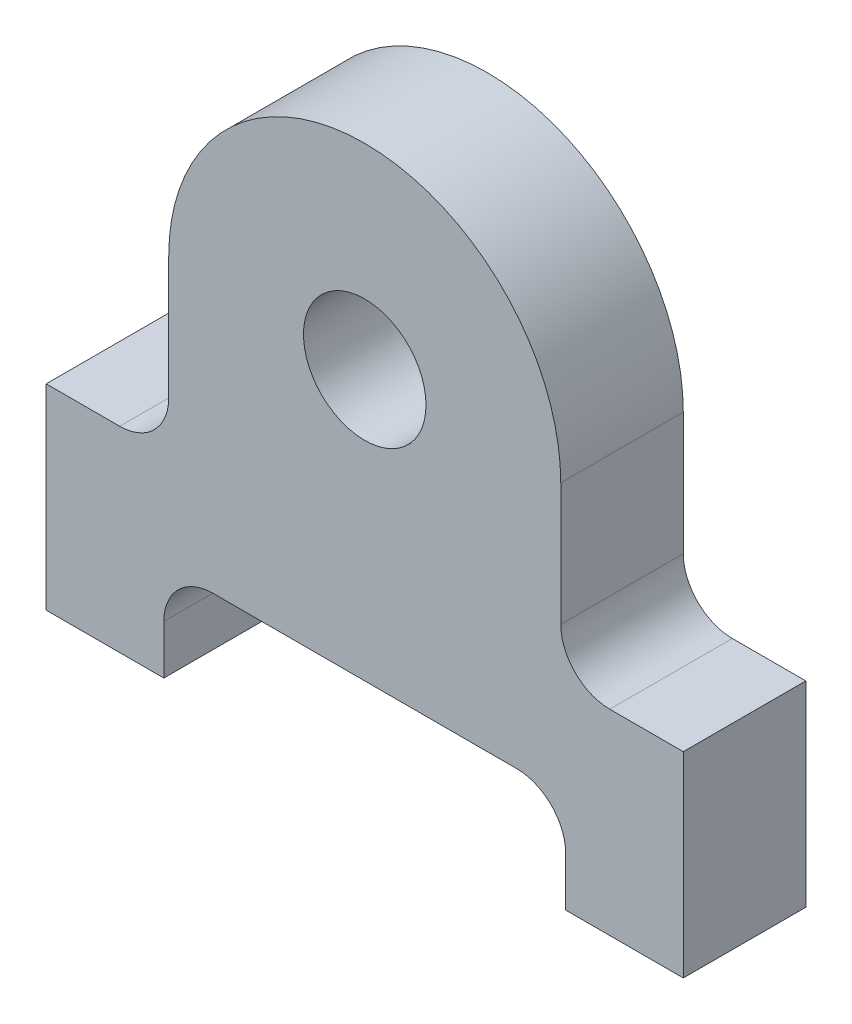
ISO-10303-21;
HEADER;
FILE_DESCRIPTION(('STEP AP214'),'2;1');
FILE_NAME('part.step','',(''),(''),'','','');
FILE_SCHEMA(('AUTOMOTIVE_DESIGN { 1 0 10303 214 1 1 1 1 }'));
ENDSEC;
DATA;
#1=APPLICATION_CONTEXT('core data for automotive mechanical design processes');
#2=APPLICATION_PROTOCOL_DEFINITION('international standard','automotive_design',2000,#1);
#3=PRODUCT_CONTEXT('',#1,'mechanical');
#4=PRODUCT('Part','Part','',(#3));
#5=PRODUCT_RELATED_PRODUCT_CATEGORY('part','',(#4));
#6=PRODUCT_DEFINITION_FORMATION('','',#4);
#7=PRODUCT_DEFINITION_CONTEXT('part definition',#1,'design');
#8=PRODUCT_DEFINITION('design','',#6,#7);
#9=PRODUCT_DEFINITION_SHAPE('','',#8);
#10=(LENGTH_UNIT() NAMED_UNIT(*) SI_UNIT(.MILLI.,.METRE.));
#11=(NAMED_UNIT(*) PLANE_ANGLE_UNIT() SI_UNIT($,.RADIAN.));
#12=(NAMED_UNIT(*) SI_UNIT($,.STERADIAN.) SOLID_ANGLE_UNIT());
#13=UNCERTAINTY_MEASURE_WITH_UNIT(LENGTH_MEASURE(1.E-05),#10,'distance_accuracy_value','');
#14=(GEOMETRIC_REPRESENTATION_CONTEXT(3) GLOBAL_UNCERTAINTY_ASSIGNED_CONTEXT((#13)) GLOBAL_UNIT_ASSIGNED_CONTEXT((#10,
#11,#12)) REPRESENTATION_CONTEXT('',''));
#15=CARTESIAN_POINT('',(0.,0.,0.));
#16=DIRECTION('',(0.,0.,1.));
#17=DIRECTION('',(1.,0.,0.));
#18=AXIS2_PLACEMENT_3D('',#15,#16,#17);
#19=CARTESIAN_POINT('',(0.,0.,3.175));
#20=DIRECTION('',(0.,0.,1.));
#21=DIRECTION('',(1.,0.,0.));
#22=AXIS2_PLACEMENT_3D('',#19,#20,#21);
#23=PLANE('',#22);
#24=CARTESIAN_POINT('',(0.,4.44499999999999,3.175));
#25=DIRECTION('',(0.,0.,1.));
#26=DIRECTION('',(1.,0.,0.));
#27=AXIS2_PLACEMENT_3D('',#24,#25,#26);
#28=CIRCLE('',#27,3.175);
#29=CARTESIAN_POINT('',(3.175,4.44499999999999,3.175));
#30=VERTEX_POINT('',#29);
#31=EDGE_CURVE('E181',#30,#30,#28,.T.);
#32=ORIENTED_EDGE('',*,*,#31,.F.);
#33=EDGE_LOOP('',(#32));
#34=FACE_BOUND('',#33,.T.);
#35=DIRECTION('',(-1.,0.,0.));
#36=VECTOR('',#35,1.);
#37=CARTESIAN_POINT('',(-7.87399999999998,-9.525,3.175));
#38=LINE('',#37,#36);
#39=CARTESIAN_POINT('',(7.87399999999998,-9.525,3.175));
#40=VERTEX_POINT('',#39);
#41=CARTESIAN_POINT('',(-7.87399999999998,-9.525,3.175));
#42=VERTEX_POINT('',#41);
#43=EDGE_CURVE('E242',#40,#42,#38,.T.);
#44=ORIENTED_EDGE('',*,*,#43,.F.);
#45=CARTESIAN_POINT('',(7.874,-12.065,3.175));
#46=DIRECTION('',(0.,0.,-1.));
#47=DIRECTION('',(-1.,0.,0.));
#48=AXIS2_PLACEMENT_3D('',#45,#46,#47);
#49=CIRCLE('',#48,2.54);
#50=CARTESIAN_POINT('',(10.414,-12.065,3.175));
#51=VERTEX_POINT('',#50);
#52=EDGE_CURVE('E196',#40,#51,#49,.T.);
#53=ORIENTED_EDGE('',*,*,#52,.T.);
#54=DIRECTION('',(0.,-1.,0.));
#55=VECTOR('',#54,1.);
#56=CARTESIAN_POINT('',(10.414,-12.065,3.175));
#57=LINE('',#56,#55);
#58=CARTESIAN_POINT('',(10.414,-14.605,3.175));
#59=VERTEX_POINT('',#58);
#60=EDGE_CURVE('E193',#51,#59,#57,.T.);
#61=ORIENTED_EDGE('',*,*,#60,.T.);
#62=DIRECTION('',(1.,0.,0.));
#63=VECTOR('',#62,1.);
#64=CARTESIAN_POINT('',(-16.51,-14.605,3.175));
#65=LINE('',#64,#63);
#66=CARTESIAN_POINT('',(16.51,-14.605,3.175));
#67=VERTEX_POINT('',#66);
#68=EDGE_CURVE('E296',#59,#67,#65,.T.);
#69=ORIENTED_EDGE('',*,*,#68,.T.);
#70=DIRECTION('',(0.,1.,0.));
#71=VECTOR('',#70,1.);
#72=CARTESIAN_POINT('',(16.51,14.605,3.175));
#73=LINE('',#72,#71);
#74=CARTESIAN_POINT('',(16.51,-4.44500000000001,3.175));
#75=VERTEX_POINT('',#74);
#76=EDGE_CURVE('E289',#67,#75,#73,.T.);
#77=ORIENTED_EDGE('',*,*,#76,.T.);
#78=DIRECTION('',(-1.,0.,0.));
#79=VECTOR('',#78,1.);
#80=CARTESIAN_POINT('',(12.7,-4.44500000000001,3.175));
#81=LINE('',#80,#79);
#82=CARTESIAN_POINT('',(12.7,-4.44500000000001,3.175));
#83=VERTEX_POINT('',#82);
#84=EDGE_CURVE('E218',#75,#83,#81,.T.);
#85=ORIENTED_EDGE('',*,*,#84,.T.);
#86=CARTESIAN_POINT('',(12.7,-1.90500000000001,3.175));
#87=DIRECTION('',(0.,0.,-1.));
#88=DIRECTION('',(1.,0.,0.));
#89=AXIS2_PLACEMENT_3D('',#86,#87,#88);
#90=CIRCLE('',#89,2.54);
#91=CARTESIAN_POINT('',(10.16,-1.90499999999999,3.175));
#92=VERTEX_POINT('',#91);
#93=EDGE_CURVE('E215',#83,#92,#90,.T.);
#94=ORIENTED_EDGE('',*,*,#93,.T.);
#95=DIRECTION('',(0.,1.,0.));
#96=VECTOR('',#95,1.);
#97=CARTESIAN_POINT('',(10.16,4.44499999999999,3.175));
#98=LINE('',#97,#96);
#99=CARTESIAN_POINT('',(10.16,4.44499999999999,3.175));
#100=VERTEX_POINT('',#99);
#101=EDGE_CURVE('E212',#92,#100,#98,.T.);
#102=ORIENTED_EDGE('',*,*,#101,.T.);
#103=CARTESIAN_POINT('',(0.,4.44499999999999,3.175));
#104=DIRECTION('',(0.,0.,-1.));
#105=DIRECTION('',(1.,0.,0.));
#106=AXIS2_PLACEMENT_3D('',#103,#104,#105);
#107=CIRCLE('',#106,10.16);
#108=CARTESIAN_POINT('',(-10.16,4.44499999999999,3.175));
#109=VERTEX_POINT('',#108);
#110=EDGE_CURVE('E269',#109,#100,#107,.T.);
#111=ORIENTED_EDGE('',*,*,#110,.F.);
#112=DIRECTION('',(0.,1.,0.));
#113=VECTOR('',#112,1.);
#114=CARTESIAN_POINT('',(-10.16,4.44499999999999,3.175));
#115=LINE('',#114,#113);
#116=CARTESIAN_POINT('',(-10.16,-1.90499999999999,3.175));
#117=VERTEX_POINT('',#116);
#118=EDGE_CURVE('E277',#117,#109,#115,.T.);
#119=ORIENTED_EDGE('',*,*,#118,.F.);
#120=CARTESIAN_POINT('',(-12.7,-1.90500000000001,3.175));
#121=DIRECTION('',(0.,0.,1.));
#122=DIRECTION('',(-1.,0.,0.));
#123=AXIS2_PLACEMENT_3D('',#120,#121,#122);
#124=CIRCLE('',#123,2.54);
#125=CARTESIAN_POINT('',(-12.7,-4.44500000000001,3.175));
#126=VERTEX_POINT('',#125);
#127=EDGE_CURVE('E274',#126,#117,#124,.T.);
#128=ORIENTED_EDGE('',*,*,#127,.F.);
#129=DIRECTION('',(1.,0.,0.));
#130=VECTOR('',#129,1.);
#131=CARTESIAN_POINT('',(-12.7,-4.44500000000001,3.175));
#132=LINE('',#131,#130);
#133=CARTESIAN_POINT('',(-16.51,-4.44500000000001,3.175));
#134=VERTEX_POINT('',#133);
#135=EDGE_CURVE('E271',#134,#126,#132,.T.);
#136=ORIENTED_EDGE('',*,*,#135,.F.);
#137=DIRECTION('',(0.,-1.,0.));
#138=VECTOR('',#137,1.);
#139=CARTESIAN_POINT('',(-16.51,14.605,3.175));
#140=LINE('',#139,#138);
#141=CARTESIAN_POINT('',(-16.51,-14.605,3.175));
#142=VERTEX_POINT('',#141);
#143=EDGE_CURVE('E293',#134,#142,#140,.T.);
#144=ORIENTED_EDGE('',*,*,#143,.T.);
#145=CARTESIAN_POINT('',(-10.414,-14.605,3.175));
#146=VERTEX_POINT('',#145);
#147=EDGE_CURVE('E297',#142,#146,#65,.T.);
#148=ORIENTED_EDGE('',*,*,#147,.T.);
#149=DIRECTION('',(0.,-1.,0.));
#150=VECTOR('',#149,1.);
#151=CARTESIAN_POINT('',(-10.414,-12.065,3.175));
#152=LINE('',#151,#150);
#153=CARTESIAN_POINT('',(-10.414,-12.065,3.175));
#154=VERTEX_POINT('',#153);
#155=EDGE_CURVE('E248',#154,#146,#152,.T.);
#156=ORIENTED_EDGE('',*,*,#155,.F.);
#157=CARTESIAN_POINT('',(-7.874,-12.065,3.175));
#158=DIRECTION('',(0.,0.,1.));
#159=DIRECTION('',(1.,0.,0.));
#160=AXIS2_PLACEMENT_3D('',#157,#158,#159);
#161=CIRCLE('',#160,2.54);
#162=EDGE_CURVE('E245',#42,#154,#161,.T.);
#163=ORIENTED_EDGE('',*,*,#162,.F.);
#164=EDGE_LOOP('',(#44,#53,#61,#69,#77,#85,#94,#102,#111,#119,#128,#136,#144,#148,#156,#163));
#165=FACE_BOUND('',#164,.T.);
#166=ADVANCED_FACE('F41',(#34,#165),#23,.T.);
#167=CARTESIAN_POINT('',(0.,0.,-3.175));
#168=DIRECTION('',(0.,0.,1.));
#169=DIRECTION('',(1.,0.,0.));
#170=AXIS2_PLACEMENT_3D('',#167,#168,#169);
#171=PLANE('',#170);
#172=CARTESIAN_POINT('',(0.,4.44499999999999,-3.175));
#173=DIRECTION('',(0.,0.,1.));
#174=DIRECTION('',(1.,0.,0.));
#175=AXIS2_PLACEMENT_3D('',#172,#173,#174);
#176=CIRCLE('',#175,3.175);
#177=CARTESIAN_POINT('',(3.175,4.44499999999999,-3.175));
#178=VERTEX_POINT('',#177);
#179=EDGE_CURVE('E184',#178,#178,#176,.F.);
#180=ORIENTED_EDGE('',*,*,#179,.F.);
#181=EDGE_LOOP('',(#180));
#182=FACE_BOUND('',#181,.T.);
#183=CARTESIAN_POINT('',(7.874,-12.065,-3.175));
#184=DIRECTION('',(0.,0.,1.));
#185=DIRECTION('',(1.,0.,0.));
#186=AXIS2_PLACEMENT_3D('',#183,#184,#185);
#187=CIRCLE('',#186,2.54);
#188=CARTESIAN_POINT('',(10.414,-12.065,-3.175));
#189=VERTEX_POINT('',#188);
#190=CARTESIAN_POINT('',(7.87399999999998,-9.525,-3.175));
#191=VERTEX_POINT('',#190);
#192=EDGE_CURVE('E190',#189,#191,#187,.T.);
#193=ORIENTED_EDGE('',*,*,#192,.T.);
#194=DIRECTION('',(1.,0.,0.));
#195=VECTOR('',#194,1.);
#196=CARTESIAN_POINT('',(-7.87399999999998,-9.525,-3.175));
#197=LINE('',#196,#195);
#198=CARTESIAN_POINT('',(-7.87399999999998,-9.525,-3.175));
#199=VERTEX_POINT('',#198);
#200=EDGE_CURVE('E254',#199,#191,#197,.T.);
#201=ORIENTED_EDGE('',*,*,#200,.F.);
#202=CARTESIAN_POINT('',(-7.874,-12.065,-3.175));
#203=DIRECTION('',(0.,0.,1.));
#204=DIRECTION('',(1.,0.,0.));
#205=AXIS2_PLACEMENT_3D('',#202,#203,#204);
#206=CIRCLE('',#205,2.54);
#207=CARTESIAN_POINT('',(-10.414,-12.065,-3.175));
#208=VERTEX_POINT('',#207);
#209=EDGE_CURVE('E56',#208,#199,#206,.F.);
#210=ORIENTED_EDGE('',*,*,#209,.F.);
#211=DIRECTION('',(0.,1.,0.));
#212=VECTOR('',#211,1.);
#213=CARTESIAN_POINT('',(-10.414,-12.065,-3.175));
#214=LINE('',#213,#212);
#215=CARTESIAN_POINT('',(-10.414,-14.605,-3.175));
#216=VERTEX_POINT('',#215);
#217=EDGE_CURVE('E239',#216,#208,#214,.T.);
#218=ORIENTED_EDGE('',*,*,#217,.F.);
#219=DIRECTION('',(1.,0.,0.));
#220=VECTOR('',#219,1.);
#221=CARTESIAN_POINT('',(-16.51,-14.605,-3.175));
#222=LINE('',#221,#220);
#223=CARTESIAN_POINT('',(-16.51,-14.605,-3.175));
#224=VERTEX_POINT('',#223);
#225=EDGE_CURVE('E294',#224,#216,#222,.T.);
#226=ORIENTED_EDGE('',*,*,#225,.F.);
#227=DIRECTION('',(0.,-1.,0.));
#228=VECTOR('',#227,1.);
#229=CARTESIAN_POINT('',(-16.51,14.605,-3.175));
#230=LINE('',#229,#228);
#231=CARTESIAN_POINT('',(-16.51,-4.44500000000001,-3.175));
#232=VERTEX_POINT('',#231);
#233=EDGE_CURVE('E302',#232,#224,#230,.T.);
#234=ORIENTED_EDGE('',*,*,#233,.F.);
#235=DIRECTION('',(-1.,0.,0.));
#236=VECTOR('',#235,1.);
#237=CARTESIAN_POINT('',(-12.7,-4.44500000000001,-3.175));
#238=LINE('',#237,#236);
#239=CARTESIAN_POINT('',(-12.7,-4.44500000000001,-3.175));
#240=VERTEX_POINT('',#239);
#241=EDGE_CURVE('E259',#240,#232,#238,.T.);
#242=ORIENTED_EDGE('',*,*,#241,.F.);
#243=CARTESIAN_POINT('',(-12.7,-1.90500000000001,-3.175));
#244=DIRECTION('',(0.,0.,1.));
#245=DIRECTION('',(1.,0.,0.));
#246=AXIS2_PLACEMENT_3D('',#243,#244,#245);
#247=CIRCLE('',#246,2.54);
#248=CARTESIAN_POINT('',(-10.16,-1.90499999999999,-3.175));
#249=VERTEX_POINT('',#248);
#250=EDGE_CURVE('E64',#249,#240,#247,.F.);
#251=ORIENTED_EDGE('',*,*,#250,.F.);
#252=DIRECTION('',(0.,-1.,0.));
#253=VECTOR('',#252,1.);
#254=CARTESIAN_POINT('',(-10.16,4.44499999999999,-3.175));
#255=LINE('',#254,#253);
#256=CARTESIAN_POINT('',(-10.16,4.44499999999999,-3.175));
#257=VERTEX_POINT('',#256);
#258=EDGE_CURVE('E262',#257,#249,#255,.T.);
#259=ORIENTED_EDGE('',*,*,#258,.F.);
#260=CARTESIAN_POINT('',(0.,4.44499999999999,-3.175));
#261=DIRECTION('',(0.,0.,1.));
#262=DIRECTION('',(1.,0.,0.));
#263=AXIS2_PLACEMENT_3D('',#260,#261,#262);
#264=CIRCLE('',#263,10.16);
#265=CARTESIAN_POINT('',(10.16,4.44499999999999,-3.175));
#266=VERTEX_POINT('',#265);
#267=EDGE_CURVE('E265',#266,#257,#264,.T.);
#268=ORIENTED_EDGE('',*,*,#267,.F.);
#269=DIRECTION('',(0.,-1.,0.));
#270=VECTOR('',#269,1.);
#271=CARTESIAN_POINT('',(10.16,4.44499999999999,-3.175));
#272=LINE('',#271,#270);
#273=CARTESIAN_POINT('',(10.16,-1.90499999999999,-3.175));
#274=VERTEX_POINT('',#273);
#275=EDGE_CURVE('E227',#266,#274,#272,.T.);
#276=ORIENTED_EDGE('',*,*,#275,.T.);
#277=CARTESIAN_POINT('',(12.7,-1.90500000000001,-3.175));
#278=DIRECTION('',(0.,0.,1.));
#279=DIRECTION('',(1.,0.,0.));
#280=AXIS2_PLACEMENT_3D('',#277,#278,#279);
#281=CIRCLE('',#280,2.54);
#282=CARTESIAN_POINT('',(12.7,-4.44500000000001,-3.175));
#283=VERTEX_POINT('',#282);
#284=EDGE_CURVE('E203',#274,#283,#281,.T.);
#285=ORIENTED_EDGE('',*,*,#284,.T.);
#286=DIRECTION('',(1.,0.,0.));
#287=VECTOR('',#286,1.);
#288=CARTESIAN_POINT('',(12.7,-4.44500000000001,-3.175));
#289=LINE('',#288,#287);
#290=CARTESIAN_POINT('',(16.51,-4.445,-3.175));
#291=VERTEX_POINT('',#290);
#292=EDGE_CURVE('E209',#283,#291,#289,.T.);
#293=ORIENTED_EDGE('',*,*,#292,.T.);
#294=DIRECTION('',(0.,1.,0.));
#295=VECTOR('',#294,1.);
#296=CARTESIAN_POINT('',(16.51,14.605,-3.175));
#297=LINE('',#296,#295);
#298=CARTESIAN_POINT('',(16.51,-14.605,-3.175));
#299=VERTEX_POINT('',#298);
#300=EDGE_CURVE('E283',#299,#291,#297,.T.);
#301=ORIENTED_EDGE('',*,*,#300,.F.);
#302=CARTESIAN_POINT('',(10.414,-14.605,-3.175));
#303=VERTEX_POINT('',#302);
#304=EDGE_CURVE('E304',#303,#299,#222,.T.);
#305=ORIENTED_EDGE('',*,*,#304,.F.);
#306=DIRECTION('',(0.,1.,0.));
#307=VECTOR('',#306,1.);
#308=CARTESIAN_POINT('',(10.414,-12.065,-3.175));
#309=LINE('',#308,#307);
#310=EDGE_CURVE('E187',#303,#189,#309,.T.);
#311=ORIENTED_EDGE('',*,*,#310,.T.);
#312=EDGE_LOOP('',(#193,#201,#210,#218,#226,#234,#242,#251,#259,#268,#276,#285,#293,#301,#305,#311));
#313=FACE_BOUND('',#312,.T.);
#314=ADVANCED_FACE('F315',(#182,#313),#171,.F.);
#315=CARTESIAN_POINT('',(-16.51,-14.605,3.175));
#316=DIRECTION('',(0.,1.,0.));
#317=DIRECTION('',(0.,0.,1.));
#318=AXIS2_PLACEMENT_3D('',#315,#316,#317);
#319=PLANE('',#318);
#320=CARTESIAN_POINT('',(13.462,-14.605,0.));
#321=DIRECTION('',(0.,-1.,0.));
#322=DIRECTION('',(0.,0.,-1.));
#323=AXIS2_PLACEMENT_3D('',#320,#321,#322);
#324=CIRCLE('',#323,1.35254999999999);
#325=CARTESIAN_POINT('',(13.462,-14.605,-1.35254999999999));
#326=VERTEX_POINT('',#325);
#327=EDGE_CURVE('E170',#326,#326,#324,.T.);
#328=ORIENTED_EDGE('',*,*,#327,.F.);
#329=EDGE_LOOP('',(#328));
#330=FACE_BOUND('',#329,.T.);
#331=DIRECTION('',(0.,0.,1.));
#332=VECTOR('',#331,1.);
#333=CARTESIAN_POINT('',(10.414,-14.605,-3.176));
#334=LINE('',#333,#332);
#335=EDGE_CURVE('E199',#303,#59,#334,.T.);
#336=ORIENTED_EDGE('',*,*,#335,.F.);
#337=ORIENTED_EDGE('',*,*,#304,.T.);
#338=DIRECTION('',(0.,0.,-1.));
#339=VECTOR('',#338,1.);
#340=CARTESIAN_POINT('',(16.51,-14.605,3.175));
#341=LINE('',#340,#339);
#342=EDGE_CURVE('E49',#67,#299,#341,.T.);
#343=ORIENTED_EDGE('',*,*,#342,.F.);
#344=ORIENTED_EDGE('',*,*,#68,.F.);
#345=EDGE_LOOP('',(#336,#337,#343,#344));
#346=FACE_BOUND('',#345,.T.);
#347=ADVANCED_FACE('F327',(#330,#346),#319,.F.);
#348=CARTESIAN_POINT('',(16.51,14.605,3.175));
#349=DIRECTION('',(-1.,0.,0.));
#350=DIRECTION('',(0.,-1.,0.));
#351=AXIS2_PLACEMENT_3D('',#348,#349,#350);
#352=PLANE('',#351);
#353=DIRECTION('',(0.,0.,1.));
#354=VECTOR('',#353,1.);
#355=CARTESIAN_POINT('',(16.51,-4.44500000000001,-3.176));
#356=LINE('',#355,#354);
#357=EDGE_CURVE('E223',#291,#75,#356,.T.);
#358=ORIENTED_EDGE('',*,*,#357,.T.);
#359=ORIENTED_EDGE('',*,*,#76,.F.);
#360=ORIENTED_EDGE('',*,*,#342,.T.);
#361=ORIENTED_EDGE('',*,*,#300,.T.);
#362=EDGE_LOOP('',(#358,#359,#360,#361));
#363=FACE_BOUND('',#362,.T.);
#364=ADVANCED_FACE('F43',(#363),#352,.F.);
#365=CARTESIAN_POINT('',(-16.51,14.605,3.175));
#366=DIRECTION('',(1.,0.,0.));
#367=DIRECTION('',(0.,1.,0.));
#368=AXIS2_PLACEMENT_3D('',#365,#366,#367);
#369=PLANE('',#368);
#370=ORIENTED_EDGE('',*,*,#143,.F.);
#371=DIRECTION('',(0.,0.,1.));
#372=VECTOR('',#371,1.);
#373=CARTESIAN_POINT('',(-16.51,-4.44500000000001,-3.176));
#374=LINE('',#373,#372);
#375=EDGE_CURVE('E280',#232,#134,#374,.T.);
#376=ORIENTED_EDGE('',*,*,#375,.F.);
#377=ORIENTED_EDGE('',*,*,#233,.T.);
#378=DIRECTION('',(0.,0.,-1.));
#379=VECTOR('',#378,1.);
#380=CARTESIAN_POINT('',(-16.51,-14.605,3.175));
#381=LINE('',#380,#379);
#382=EDGE_CURVE('E11',#142,#224,#381,.T.);
#383=ORIENTED_EDGE('',*,*,#382,.F.);
#384=EDGE_LOOP('',(#370,#376,#377,#383));
#385=FACE_BOUND('',#384,.T.);
#386=ADVANCED_FACE('F354',(#385),#369,.F.);
#387=CARTESIAN_POINT('',(-13.462,-14.605,0.));
#388=DIRECTION('',(0.,-1.,0.));
#389=DIRECTION('',(0.,0.,-1.));
#390=AXIS2_PLACEMENT_3D('',#387,#388,#389);
#391=CIRCLE('',#390,1.35254999999999);
#392=CARTESIAN_POINT('',(-13.462,-14.605,-1.35254999999999));
#393=VERTEX_POINT('',#392);
#394=EDGE_CURVE('E171',#393,#393,#391,.T.);
#395=ORIENTED_EDGE('',*,*,#394,.F.);
#396=EDGE_LOOP('',(#395));
#397=FACE_BOUND('',#396,.T.);
#398=ORIENTED_EDGE('',*,*,#225,.T.);
#399=DIRECTION('',(0.,0.,1.));
#400=VECTOR('',#399,1.);
#401=CARTESIAN_POINT('',(-10.414,-14.605,-3.176));
#402=LINE('',#401,#400);
#403=EDGE_CURVE('E251',#216,#146,#402,.T.);
#404=ORIENTED_EDGE('',*,*,#403,.T.);
#405=ORIENTED_EDGE('',*,*,#147,.F.);
#406=ORIENTED_EDGE('',*,*,#382,.T.);
#407=EDGE_LOOP('',(#398,#404,#405,#406));
#408=FACE_BOUND('',#407,.T.);
#409=ADVANCED_FACE('F346',(#397,#408),#319,.F.);
#410=CARTESIAN_POINT('',(0.,4.44499999999999,-3.176));
#411=DIRECTION('',(0.,0.,1.));
#412=DIRECTION('',(1.,0.,0.));
#413=AXIS2_PLACEMENT_3D('',#410,#411,#412);
#414=CYLINDRICAL_SURFACE('',#413,10.16);
#415=ORIENTED_EDGE('',*,*,#267,.T.);
#416=DIRECTION('',(0.,0.,1.));
#417=VECTOR('',#416,1.);
#418=CARTESIAN_POINT('',(-10.16,4.44499999999999,-3.176));
#419=LINE('',#418,#417);
#420=EDGE_CURVE('E281',#257,#109,#419,.T.);
#421=ORIENTED_EDGE('',*,*,#420,.T.);
#422=ORIENTED_EDGE('',*,*,#110,.T.);
#423=DIRECTION('',(0.,0.,1.));
#424=VECTOR('',#423,1.);
#425=CARTESIAN_POINT('',(10.16,4.44499999999999,-3.176));
#426=LINE('',#425,#424);
#427=EDGE_CURVE('E222',#266,#100,#426,.T.);
#428=ORIENTED_EDGE('',*,*,#427,.F.);
#429=EDGE_LOOP('',(#415,#421,#422,#428));
#430=FACE_BOUND('',#429,.T.);
#431=ADVANCED_FACE('F370',(#430),#414,.T.);
#432=CARTESIAN_POINT('',(-10.16,4.44499999999999,-3.176));
#433=DIRECTION('',(1.,0.,0.));
#434=DIRECTION('',(0.,1.,0.));
#435=AXIS2_PLACEMENT_3D('',#432,#433,#434);
#436=PLANE('',#435);
#437=ORIENTED_EDGE('',*,*,#258,.T.);
#438=DIRECTION('',(0.,0.,1.));
#439=VECTOR('',#438,1.);
#440=CARTESIAN_POINT('',(-10.16,-1.90499999999999,-3.176));
#441=LINE('',#440,#439);
#442=EDGE_CURVE('E284',#249,#117,#441,.T.);
#443=ORIENTED_EDGE('',*,*,#442,.T.);
#444=ORIENTED_EDGE('',*,*,#118,.T.);
#445=ORIENTED_EDGE('',*,*,#420,.F.);
#446=EDGE_LOOP('',(#437,#443,#444,#445));
#447=FACE_BOUND('',#446,.T.);
#448=ADVANCED_FACE('F364',(#447),#436,.F.);
#449=CARTESIAN_POINT('',(-12.7,-1.90500000000001,-3.176));
#450=DIRECTION('',(0.,0.,1.));
#451=DIRECTION('',(1.,0.,0.));
#452=AXIS2_PLACEMENT_3D('',#449,#450,#451);
#453=CYLINDRICAL_SURFACE('',#452,2.54);
#454=ORIENTED_EDGE('',*,*,#250,.T.);
#455=DIRECTION('',(0.,0.,1.));
#456=VECTOR('',#455,1.);
#457=CARTESIAN_POINT('',(-12.7,-4.44500000000001,-3.176));
#458=LINE('',#457,#456);
#459=EDGE_CURVE('E286',#240,#126,#458,.T.);
#460=ORIENTED_EDGE('',*,*,#459,.T.);
#461=ORIENTED_EDGE('',*,*,#127,.T.);
#462=ORIENTED_EDGE('',*,*,#442,.F.);
#463=EDGE_LOOP('',(#454,#460,#461,#462));
#464=FACE_BOUND('',#463,.T.);
#465=ADVANCED_FACE('F361',(#464),#453,.F.);
#466=CARTESIAN_POINT('',(-12.7,-4.44500000000001,-3.176));
#467=DIRECTION('',(0.,-1.,0.));
#468=DIRECTION('',(1.,0.,0.));
#469=AXIS2_PLACEMENT_3D('',#466,#467,#468);
#470=PLANE('',#469);
#471=ORIENTED_EDGE('',*,*,#241,.T.);
#472=ORIENTED_EDGE('',*,*,#375,.T.);
#473=ORIENTED_EDGE('',*,*,#135,.T.);
#474=ORIENTED_EDGE('',*,*,#459,.F.);
#475=EDGE_LOOP('',(#471,#472,#473,#474));
#476=FACE_BOUND('',#475,.T.);
#477=ADVANCED_FACE('F357',(#476),#470,.F.);
#478=CARTESIAN_POINT('',(-10.414,-12.065,-3.176));
#479=DIRECTION('',(-1.,0.,0.));
#480=DIRECTION('',(0.,0.,1.));
#481=AXIS2_PLACEMENT_3D('',#478,#479,#480);
#482=PLANE('',#481);
#483=ORIENTED_EDGE('',*,*,#217,.T.);
#484=DIRECTION('',(0.,0.,1.));
#485=VECTOR('',#484,1.);
#486=CARTESIAN_POINT('',(-10.414,-12.065,-3.176));
#487=LINE('',#486,#485);
#488=EDGE_CURVE('E255',#208,#154,#487,.T.);
#489=ORIENTED_EDGE('',*,*,#488,.T.);
#490=ORIENTED_EDGE('',*,*,#155,.T.);
#491=ORIENTED_EDGE('',*,*,#403,.F.);
#492=EDGE_LOOP('',(#483,#489,#490,#491));
#493=FACE_BOUND('',#492,.T.);
#494=ADVANCED_FACE('F343',(#493),#482,.F.);
#495=CARTESIAN_POINT('',(-7.874,-12.065,-3.176));
#496=DIRECTION('',(0.,0.,1.));
#497=DIRECTION('',(1.,0.,0.));
#498=AXIS2_PLACEMENT_3D('',#495,#496,#497);
#499=CYLINDRICAL_SURFACE('',#498,2.54);
#500=ORIENTED_EDGE('',*,*,#209,.T.);
#501=DIRECTION('',(0.,0.,1.));
#502=VECTOR('',#501,1.);
#503=CARTESIAN_POINT('',(-7.87399999999998,-9.525,-3.176));
#504=LINE('',#503,#502);
#505=EDGE_CURVE('E250',#199,#42,#504,.T.);
#506=ORIENTED_EDGE('',*,*,#505,.T.);
#507=ORIENTED_EDGE('',*,*,#162,.T.);
#508=ORIENTED_EDGE('',*,*,#488,.F.);
#509=EDGE_LOOP('',(#500,#506,#507,#508));
#510=FACE_BOUND('',#509,.T.);
#511=ADVANCED_FACE('F339',(#510),#499,.F.);
#512=CARTESIAN_POINT('',(-7.87399999999998,-9.525,-3.176));
#513=DIRECTION('',(0.,1.,0.));
#514=DIRECTION('',(0.,0.,1.));
#515=AXIS2_PLACEMENT_3D('',#512,#513,#514);
#516=PLANE('',#515);
#517=ORIENTED_EDGE('',*,*,#200,.T.);
#518=DIRECTION('',(0.,0.,1.));
#519=VECTOR('',#518,1.);
#520=CARTESIAN_POINT('',(7.87399999999998,-9.525,-3.176));
#521=LINE('',#520,#519);
#522=EDGE_CURVE('E200',#191,#40,#521,.T.);
#523=ORIENTED_EDGE('',*,*,#522,.T.);
#524=ORIENTED_EDGE('',*,*,#43,.T.);
#525=ORIENTED_EDGE('',*,*,#505,.F.);
#526=EDGE_LOOP('',(#517,#523,#524,#525));
#527=FACE_BOUND('',#526,.T.);
#528=ADVANCED_FACE('F337',(#527),#516,.F.);
#529=CARTESIAN_POINT('',(12.7,-4.44500000000001,-3.176));
#530=DIRECTION('',(0.,1.,0.));
#531=DIRECTION('',(-1.,0.,0.));
#532=AXIS2_PLACEMENT_3D('',#529,#530,#531);
#533=PLANE('',#532);
#534=DIRECTION('',(0.,0.,1.));
#535=VECTOR('',#534,1.);
#536=CARTESIAN_POINT('',(12.7,-4.44500000000001,-3.176));
#537=LINE('',#536,#535);
#538=EDGE_CURVE('E228',#283,#83,#537,.T.);
#539=ORIENTED_EDGE('',*,*,#538,.T.);
#540=ORIENTED_EDGE('',*,*,#84,.F.);
#541=ORIENTED_EDGE('',*,*,#357,.F.);
#542=ORIENTED_EDGE('',*,*,#292,.F.);
#543=EDGE_LOOP('',(#539,#540,#541,#542));
#544=FACE_BOUND('',#543,.T.);
#545=ADVANCED_FACE('F318',(#544),#533,.T.);
#546=CARTESIAN_POINT('',(12.7,-1.90500000000001,-3.176));
#547=DIRECTION('',(0.,0.,1.));
#548=DIRECTION('',(1.,0.,0.));
#549=AXIS2_PLACEMENT_3D('',#546,#547,#548);
#550=CYLINDRICAL_SURFACE('',#549,2.54);
#551=DIRECTION('',(0.,0.,1.));
#552=VECTOR('',#551,1.);
#553=CARTESIAN_POINT('',(10.16,-1.90499999999999,-3.176));
#554=LINE('',#553,#552);
#555=EDGE_CURVE('E230',#274,#92,#554,.T.);
#556=ORIENTED_EDGE('',*,*,#555,.T.);
#557=ORIENTED_EDGE('',*,*,#93,.F.);
#558=ORIENTED_EDGE('',*,*,#538,.F.);
#559=ORIENTED_EDGE('',*,*,#284,.F.);
#560=EDGE_LOOP('',(#556,#557,#558,#559));
#561=FACE_BOUND('',#560,.T.);
#562=ADVANCED_FACE('F321',(#561),#550,.F.);
#563=CARTESIAN_POINT('',(10.16,4.44499999999999,-3.176));
#564=DIRECTION('',(1.,0.,0.));
#565=DIRECTION('',(0.,1.,0.));
#566=AXIS2_PLACEMENT_3D('',#563,#564,#565);
#567=PLANE('',#566);
#568=ORIENTED_EDGE('',*,*,#427,.T.);
#569=ORIENTED_EDGE('',*,*,#101,.F.);
#570=ORIENTED_EDGE('',*,*,#555,.F.);
#571=ORIENTED_EDGE('',*,*,#275,.F.);
#572=EDGE_LOOP('',(#568,#569,#570,#571));
#573=FACE_BOUND('',#572,.T.);
#574=ADVANCED_FACE('F369',(#573),#567,.T.);
#575=CARTESIAN_POINT('',(7.874,-12.065,-3.176));
#576=DIRECTION('',(0.,0.,1.));
#577=DIRECTION('',(1.,0.,0.));
#578=AXIS2_PLACEMENT_3D('',#575,#576,#577);
#579=CYLINDRICAL_SURFACE('',#578,2.54);
#580=DIRECTION('',(0.,0.,1.));
#581=VECTOR('',#580,1.);
#582=CARTESIAN_POINT('',(10.414,-12.065,-3.176));
#583=LINE('',#582,#581);
#584=EDGE_CURVE('E204',#189,#51,#583,.T.);
#585=ORIENTED_EDGE('',*,*,#584,.T.);
#586=ORIENTED_EDGE('',*,*,#52,.F.);
#587=ORIENTED_EDGE('',*,*,#522,.F.);
#588=ORIENTED_EDGE('',*,*,#192,.F.);
#589=EDGE_LOOP('',(#585,#586,#587,#588));
#590=FACE_BOUND('',#589,.T.);
#591=ADVANCED_FACE('F334',(#590),#579,.F.);
#592=CARTESIAN_POINT('',(10.414,-12.065,-3.176));
#593=DIRECTION('',(-1.,0.,0.));
#594=DIRECTION('',(0.,0.,1.));
#595=AXIS2_PLACEMENT_3D('',#592,#593,#594);
#596=PLANE('',#595);
#597=ORIENTED_EDGE('',*,*,#335,.T.);
#598=ORIENTED_EDGE('',*,*,#60,.F.);
#599=ORIENTED_EDGE('',*,*,#584,.F.);
#600=ORIENTED_EDGE('',*,*,#310,.F.);
#601=EDGE_LOOP('',(#597,#598,#599,#600));
#602=FACE_BOUND('',#601,.T.);
#603=ADVANCED_FACE('F329',(#602),#596,.T.);
#604=CARTESIAN_POINT('',(0.,4.44499999999999,-3.176));
#605=DIRECTION('',(0.,0.,1.));
#606=DIRECTION('',(1.,0.,0.));
#607=AXIS2_PLACEMENT_3D('',#604,#605,#606);
#608=CYLINDRICAL_SURFACE('',#607,3.175);
#609=ORIENTED_EDGE('',*,*,#31,.T.);
#610=EDGE_LOOP('',(#609));
#611=FACE_BOUND('',#610,.T.);
#612=ORIENTED_EDGE('',*,*,#179,.T.);
#613=EDGE_LOOP('',(#612));
#614=FACE_BOUND('',#613,.T.);
#615=ADVANCED_FACE('F409',(#611,#614),#608,.F.);
#616=CARTESIAN_POINT('',(13.462,-5.71500000000001,0.));
#617=DIRECTION('',(0.,-1.,0.));
#618=DIRECTION('',(0.,0.,-1.));
#619=AXIS2_PLACEMENT_3D('',#616,#617,#618);
#620=CONICAL_SURFACE('',#619,1.35255,1.02974425867665);
#621=CARTESIAN_POINT('',(13.462,-4.90230596973428,0.));
#622=VERTEX_POINT('',#621);
#623=VERTEX_LOOP('',#622);
#624=FACE_BOUND('',#623,.T.);
#625=CARTESIAN_POINT('',(13.462,-5.71500000000001,0.));
#626=DIRECTION('',(0.,-1.,0.));
#627=DIRECTION('',(0.,0.,-1.));
#628=AXIS2_PLACEMENT_3D('',#625,#626,#627);
#629=CIRCLE('',#628,1.35255);
#630=CARTESIAN_POINT('',(13.462,-5.71500000000001,-1.35255));
#631=VERTEX_POINT('',#630);
#632=EDGE_CURVE('E174',#631,#631,#629,.T.);
#633=ORIENTED_EDGE('',*,*,#632,.T.);
#634=EDGE_LOOP('',(#633));
#635=FACE_BOUND('',#634,.T.);
#636=ADVANCED_FACE('F403',(#624,#635),#620,.F.);
#637=CARTESIAN_POINT('',(13.462,-14.605,0.));
#638=DIRECTION('',(0.,-1.,0.));
#639=DIRECTION('',(0.,0.,-1.));
#640=AXIS2_PLACEMENT_3D('',#637,#638,#639);
#641=CYLINDRICAL_SURFACE('',#640,1.35254999999999);
#642=ORIENTED_EDGE('',*,*,#632,.F.);
#643=EDGE_LOOP('',(#642));
#644=FACE_BOUND('',#643,.T.);
#645=ORIENTED_EDGE('',*,*,#327,.T.);
#646=EDGE_LOOP('',(#645));
#647=FACE_BOUND('',#646,.T.);
#648=ADVANCED_FACE('F164',(#644,#647),#641,.F.);
#649=CARTESIAN_POINT('',(-13.462,-5.71500000000001,0.));
#650=DIRECTION('',(0.,-1.,0.));
#651=DIRECTION('',(0.,0.,-1.));
#652=AXIS2_PLACEMENT_3D('',#649,#650,#651);
#653=CONICAL_SURFACE('',#652,1.35255,1.02974425867665);
#654=CARTESIAN_POINT('',(-13.462,-4.90230596973428,0.));
#655=VERTEX_POINT('',#654);
#656=VERTEX_LOOP('',#655);
#657=FACE_BOUND('',#656,.T.);
#658=CARTESIAN_POINT('',(-13.462,-5.71500000000001,0.));
#659=DIRECTION('',(0.,-1.,0.));
#660=DIRECTION('',(0.,0.,-1.));
#661=AXIS2_PLACEMENT_3D('',#658,#659,#660);
#662=CIRCLE('',#661,1.35255);
#663=CARTESIAN_POINT('',(-13.462,-5.71500000000001,-1.35255));
#664=VERTEX_POINT('',#663);
#665=EDGE_CURVE('E168',#664,#664,#662,.T.);
#666=ORIENTED_EDGE('',*,*,#665,.T.);
#667=EDGE_LOOP('',(#666));
#668=FACE_BOUND('',#667,.T.);
#669=ADVANCED_FACE('F160',(#657,#668),#653,.F.);
#670=CARTESIAN_POINT('',(-13.462,-14.605,0.));
#671=DIRECTION('',(0.,-1.,0.));
#672=DIRECTION('',(0.,0.,-1.));
#673=AXIS2_PLACEMENT_3D('',#670,#671,#672);
#674=CYLINDRICAL_SURFACE('',#673,1.35254999999999);
#675=ORIENTED_EDGE('',*,*,#665,.F.);
#676=EDGE_LOOP('',(#675));
#677=FACE_BOUND('',#676,.T.);
#678=ORIENTED_EDGE('',*,*,#394,.T.);
#679=EDGE_LOOP('',(#678));
#680=FACE_BOUND('',#679,.T.);
#681=ADVANCED_FACE('F163',(#677,#680),#674,.F.);
#682=CLOSED_SHELL('',(#166,#314,#347,#364,#386,#409,#431,#448,#465,#477,#494,#511,#528,#545,
#562,#574,#591,#603,#615,#636,#648,#669,#681));
#683=MANIFOLD_SOLID_BREP('B2',#682);
#684=ADVANCED_BREP_SHAPE_REPRESENTATION('',(#18,#683),#14);
#685=SHAPE_DEFINITION_REPRESENTATION(#9,#684);
ENDSEC;
END-ISO-10303-21;
